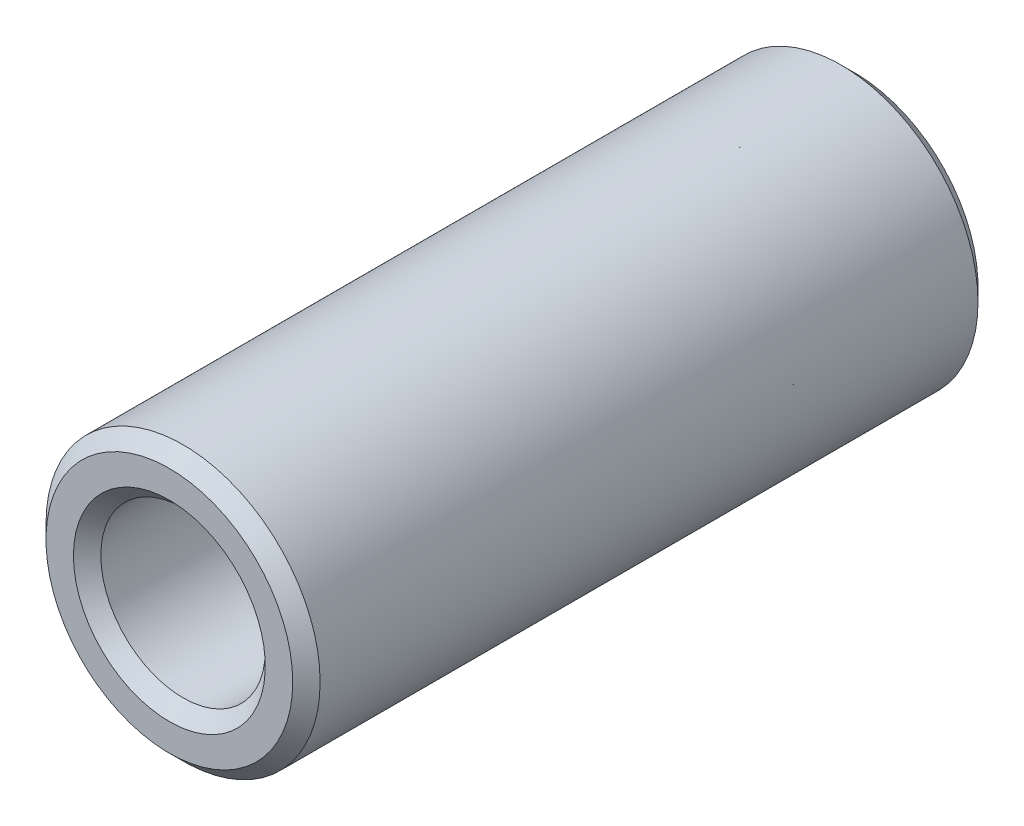
ISO-10303-21;
HEADER;
FILE_DESCRIPTION(('STEP AP214'),'2;1');
FILE_NAME('part.step','',(''),(''),'','','');
FILE_SCHEMA(('AUTOMOTIVE_DESIGN { 1 0 10303 214 1 1 1 1 }'));
ENDSEC;
DATA;
#1=APPLICATION_CONTEXT('core data for automotive mechanical design processes');
#2=APPLICATION_PROTOCOL_DEFINITION('international standard','automotive_design',2000,#1);
#3=PRODUCT_CONTEXT('',#1,'mechanical');
#4=PRODUCT('Part','Part','',(#3));
#5=PRODUCT_RELATED_PRODUCT_CATEGORY('part','',(#4));
#6=PRODUCT_DEFINITION_FORMATION('','',#4);
#7=PRODUCT_DEFINITION_CONTEXT('part definition',#1,'design');
#8=PRODUCT_DEFINITION('design','',#6,#7);
#9=PRODUCT_DEFINITION_SHAPE('','',#8);
#10=(LENGTH_UNIT() NAMED_UNIT(*) SI_UNIT(.MILLI.,.METRE.));
#11=(NAMED_UNIT(*) PLANE_ANGLE_UNIT() SI_UNIT($,.RADIAN.));
#12=(NAMED_UNIT(*) SI_UNIT($,.STERADIAN.) SOLID_ANGLE_UNIT());
#13=UNCERTAINTY_MEASURE_WITH_UNIT(LENGTH_MEASURE(1.E-05),#10,'distance_accuracy_value','');
#14=(GEOMETRIC_REPRESENTATION_CONTEXT(3) GLOBAL_UNCERTAINTY_ASSIGNED_CONTEXT((#13)) GLOBAL_UNIT_ASSIGNED_CONTEXT((#10,
#11,#12)) REPRESENTATION_CONTEXT('',''));
#15=CARTESIAN_POINT('',(0.,0.,0.));
#16=DIRECTION('',(0.,0.,1.));
#17=DIRECTION('',(1.,0.,0.));
#18=AXIS2_PLACEMENT_3D('',#15,#16,#17);
#19=CARTESIAN_POINT('',(3.,0.,-0.5));
#20=CARTESIAN_POINT('',(3.,0.,-24.5));
#21=(BOUNDED_CURVE() B_SPLINE_CURVE(1,(#19,#20),.UNSPECIFIED.,.F.,
.F.) B_SPLINE_CURVE_WITH_KNOTS((2,2),(0.,0.999999999999092),
.UNSPECIFIED.) CURVE() GEOMETRIC_REPRESENTATION_ITEM() RATIONAL_B_SPLINE_CURVE((1.,1.)) REPRESENTATION_ITEM(''));
#22=CARTESIAN_POINT('',(0.,0.,0.));
#23=DIRECTION('',(0.,0.,-1.));
#24=AXIS1_PLACEMENT('',#22,#23);
#25=SURFACE_OF_REVOLUTION('',#21,#24);
#26=CARTESIAN_POINT('',(0.,0.,-0.499999999999945));
#27=DIRECTION('',(0.,0.,-1.));
#28=DIRECTION('',(-1.,0.,0.));
#29=AXIS2_PLACEMENT_3D('',#26,#27,#28);
#30=CIRCLE('',#29,3.);
#31=CARTESIAN_POINT('',(-3.,0.,-0.5));
#32=VERTEX_POINT('',#31);
#33=EDGE_CURVE('E82',#32,#32,#30,.F.);
#34=ORIENTED_EDGE('',*,*,#33,.T.);
#35=EDGE_LOOP('',(#34));
#36=FACE_BOUND('',#35,.T.);
#37=CARTESIAN_POINT('',(0.,0.,-24.5));
#38=DIRECTION('',(0.,0.,1.));
#39=DIRECTION('',(1.,0.,0.));
#40=AXIS2_PLACEMENT_3D('',#37,#38,#39);
#41=CIRCLE('',#40,3.);
#42=CARTESIAN_POINT('',(3.,0.,-24.5));
#43=VERTEX_POINT('',#42);
#44=EDGE_CURVE('E55',#43,#43,#41,.F.);
#45=ORIENTED_EDGE('',*,*,#44,.T.);
#46=EDGE_LOOP('',(#45));
#47=FACE_BOUND('',#46,.T.);
#48=ADVANCED_FACE('F51',(#36,#47),#25,.F.);
#49=CARTESIAN_POINT('',(3.,0.,-24.5));
#50=CARTESIAN_POINT('',(3.5,0.,-25.));
#51=(BOUNDED_CURVE() B_SPLINE_CURVE(1,(#49,#50),.UNSPECIFIED.,.F.,
.F.) B_SPLINE_CURVE_WITH_KNOTS((2,2),(0.,1.00000000006823),
.UNSPECIFIED.) CURVE() GEOMETRIC_REPRESENTATION_ITEM() RATIONAL_B_SPLINE_CURVE((1.,1.)) REPRESENTATION_ITEM(''));
#52=CARTESIAN_POINT('',(0.,0.,975.));
#53=DIRECTION('',(0.,0.,-1.));
#54=AXIS1_PLACEMENT('',#52,#53);
#55=SURFACE_OF_REVOLUTION('',#51,#54);
#56=ORIENTED_EDGE('',*,*,#44,.F.);
#57=EDGE_LOOP('',(#56));
#58=FACE_BOUND('',#57,.T.);
#59=CARTESIAN_POINT('',(0.,0.,-25.));
#60=DIRECTION('',(0.,0.,1.));
#61=DIRECTION('',(1.,0.,0.));
#62=AXIS2_PLACEMENT_3D('',#59,#60,#61);
#63=CIRCLE('',#62,3.5);
#64=CARTESIAN_POINT('',(3.5,0.,-25.));
#65=VERTEX_POINT('',#64);
#66=EDGE_CURVE('E80',#65,#65,#63,.T.);
#67=ORIENTED_EDGE('',*,*,#66,.F.);
#68=EDGE_LOOP('',(#67));
#69=FACE_BOUND('',#68,.T.);
#70=ADVANCED_FACE('F90',(#58,#69),#55,.F.);
#71=CARTESIAN_POINT('',(-3.,0.,-0.5));
#72=CARTESIAN_POINT('',(-3.5,0.,0.));
#73=(BOUNDED_CURVE() B_SPLINE_CURVE(1,(#71,#72),.UNSPECIFIED.,.F.,
.F.) B_SPLINE_CURVE_WITH_KNOTS((2,2),(0.,1.),
.UNSPECIFIED.) CURVE() GEOMETRIC_REPRESENTATION_ITEM() RATIONAL_B_SPLINE_CURVE((1.,1.)) REPRESENTATION_ITEM(''));
#74=CARTESIAN_POINT('',(0.,0.,-1000.));
#75=DIRECTION('',(0.,0.,1.));
#76=AXIS1_PLACEMENT('',#74,#75);
#77=SURFACE_OF_REVOLUTION('',#73,#76);
#78=ORIENTED_EDGE('',*,*,#33,.F.);
#79=EDGE_LOOP('',(#78));
#80=FACE_BOUND('',#79,.T.);
#81=CARTESIAN_POINT('',(0.,0.,0.));
#82=DIRECTION('',(0.,0.,-1.));
#83=DIRECTION('',(-1.,0.,0.));
#84=AXIS2_PLACEMENT_3D('',#81,#82,#83);
#85=CIRCLE('',#84,3.5);
#86=CARTESIAN_POINT('',(-3.5,0.,0.));
#87=VERTEX_POINT('',#86);
#88=EDGE_CURVE('E77',#87,#87,#85,.F.);
#89=ORIENTED_EDGE('',*,*,#88,.T.);
#90=EDGE_LOOP('',(#89));
#91=FACE_BOUND('',#90,.T.);
#92=ADVANCED_FACE('F93',(#80,#91),#77,.F.);
#93=CARTESIAN_POINT('',(4.554,-4.554,-25.));
#94=DIRECTION('',(0.,0.,1.));
#95=DIRECTION('',(-1.,0.,0.));
#96=AXIS2_PLACEMENT_3D('',#93,#94,#95);
#97=PLANE('',#96);
#98=ORIENTED_EDGE('',*,*,#66,.T.);
#99=EDGE_LOOP('',(#98));
#100=FACE_BOUND('',#99,.T.);
#101=CARTESIAN_POINT('',(0.,0.,-25.));
#102=DIRECTION('',(0.,0.,-1.));
#103=DIRECTION('',(-1.,0.,0.));
#104=AXIS2_PLACEMENT_3D('',#101,#102,#103);
#105=CIRCLE('',#104,4.5);
#106=CARTESIAN_POINT('',(-4.5,0.,-25.));
#107=VERTEX_POINT('',#106);
#108=EDGE_CURVE('E74',#107,#107,#105,.F.);
#109=ORIENTED_EDGE('',*,*,#108,.F.);
#110=EDGE_LOOP('',(#109));
#111=FACE_BOUND('',#110,.T.);
#112=ADVANCED_FACE('F97',(#100,#111),#97,.F.);
#113=CARTESIAN_POINT('',(4.554,-4.554,0.));
#114=DIRECTION('',(0.,0.,1.));
#115=DIRECTION('',(-1.,0.,0.));
#116=AXIS2_PLACEMENT_3D('',#113,#114,#115);
#117=PLANE('',#116);
#118=ORIENTED_EDGE('',*,*,#88,.F.);
#119=EDGE_LOOP('',(#118));
#120=FACE_BOUND('',#119,.T.);
#121=CARTESIAN_POINT('',(0.,0.,0.));
#122=DIRECTION('',(0.,0.,1.));
#123=DIRECTION('',(1.,0.,0.));
#124=AXIS2_PLACEMENT_3D('',#121,#122,#123);
#125=CIRCLE('',#124,4.5);
#126=CARTESIAN_POINT('',(4.5,0.,0.));
#127=VERTEX_POINT('',#126);
#128=EDGE_CURVE('E64',#127,#127,#125,.F.);
#129=ORIENTED_EDGE('',*,*,#128,.F.);
#130=EDGE_LOOP('',(#129));
#131=FACE_BOUND('',#130,.T.);
#132=ADVANCED_FACE('F53',(#120,#131),#117,.T.);
#133=CARTESIAN_POINT('',(-4.5,0.,-25.));
#134=CARTESIAN_POINT('',(-5.,0.,-24.5));
#135=(BOUNDED_CURVE() B_SPLINE_CURVE(1,(#133,#134),.UNSPECIFIED.,.F.,
.F.) B_SPLINE_CURVE_WITH_KNOTS((2,2),(0.,1.),
.UNSPECIFIED.) CURVE() GEOMETRIC_REPRESENTATION_ITEM() RATIONAL_B_SPLINE_CURVE((1.,1.)) REPRESENTATION_ITEM(''));
#136=CARTESIAN_POINT('',(0.,0.,-1024.5));
#137=DIRECTION('',(0.,0.,1.));
#138=AXIS1_PLACEMENT('',#136,#137);
#139=SURFACE_OF_REVOLUTION('',#135,#138);
#140=CARTESIAN_POINT('',(0.,0.,-24.5));
#141=DIRECTION('',(0.,0.,-1.));
#142=DIRECTION('',(-1.,0.,0.));
#143=AXIS2_PLACEMENT_3D('',#140,#141,#142);
#144=CIRCLE('',#143,5.);
#145=CARTESIAN_POINT('',(-5.,0.,-24.5));
#146=VERTEX_POINT('',#145);
#147=EDGE_CURVE('E59',#146,#146,#144,.F.);
#148=ORIENTED_EDGE('',*,*,#147,.F.);
#149=EDGE_LOOP('',(#148));
#150=FACE_BOUND('',#149,.T.);
#151=ORIENTED_EDGE('',*,*,#108,.T.);
#152=EDGE_LOOP('',(#151));
#153=FACE_BOUND('',#152,.T.);
#154=ADVANCED_FACE('F102',(#150,#153),#139,.T.);
#155=CARTESIAN_POINT('',(4.5,0.,0.));
#156=CARTESIAN_POINT('',(5.,0.,-0.5));
#157=(BOUNDED_CURVE() B_SPLINE_CURVE(1,(#155,#156),.UNSPECIFIED.,.F.,
.F.) B_SPLINE_CURVE_WITH_KNOTS((2,2),(0.,1.),
.UNSPECIFIED.) CURVE() GEOMETRIC_REPRESENTATION_ITEM() RATIONAL_B_SPLINE_CURVE((1.,1.)) REPRESENTATION_ITEM(''));
#158=CARTESIAN_POINT('',(0.,0.,999.5));
#159=DIRECTION('',(0.,0.,-1.));
#160=AXIS1_PLACEMENT('',#158,#159);
#161=SURFACE_OF_REVOLUTION('',#157,#160);
#162=ORIENTED_EDGE('',*,*,#128,.T.);
#163=EDGE_LOOP('',(#162));
#164=FACE_BOUND('',#163,.T.);
#165=CARTESIAN_POINT('',(0.,0.,-0.499999999999945));
#166=DIRECTION('',(0.,0.,1.));
#167=DIRECTION('',(1.,0.,0.));
#168=AXIS2_PLACEMENT_3D('',#165,#166,#167);
#169=CIRCLE('',#168,5.);
#170=CARTESIAN_POINT('',(5.,0.,-0.5));
#171=VERTEX_POINT('',#170);
#172=EDGE_CURVE('E10',#171,#171,#169,.F.);
#173=ORIENTED_EDGE('',*,*,#172,.F.);
#174=EDGE_LOOP('',(#173));
#175=FACE_BOUND('',#174,.T.);
#176=ADVANCED_FACE('F104',(#164,#175),#161,.T.);
#177=CARTESIAN_POINT('',(5.,0.,-0.5));
#178=CARTESIAN_POINT('',(5.,0.,-24.5));
#179=(BOUNDED_CURVE() B_SPLINE_CURVE(1,(#177,#178),.UNSPECIFIED.,.F.,
.F.) B_SPLINE_CURVE_WITH_KNOTS((2,2),(0.,1.),
.UNSPECIFIED.) CURVE() GEOMETRIC_REPRESENTATION_ITEM() RATIONAL_B_SPLINE_CURVE((1.,1.)) REPRESENTATION_ITEM(''));
#180=CARTESIAN_POINT('',(0.,0.,0.));
#181=DIRECTION('',(0.,0.,-1.));
#182=AXIS1_PLACEMENT('',#180,#181);
#183=SURFACE_OF_REVOLUTION('',#179,#182);
#184=ORIENTED_EDGE('',*,*,#147,.T.);
#185=EDGE_LOOP('',(#184));
#186=FACE_BOUND('',#185,.T.);
#187=ORIENTED_EDGE('',*,*,#172,.T.);
#188=EDGE_LOOP('',(#187));
#189=FACE_BOUND('',#188,.T.);
#190=ADVANCED_FACE('F111',(#186,#189),#183,.T.);
#191=CLOSED_SHELL('',(#48,#70,#92,#112,#132,#154,#176,#190));
#192=MANIFOLD_SOLID_BREP('B2',#191);
#193=ADVANCED_BREP_SHAPE_REPRESENTATION('',(#18,#192),#14);
#194=SHAPE_DEFINITION_REPRESENTATION(#9,#193);
ENDSEC;
END-ISO-10303-21;
